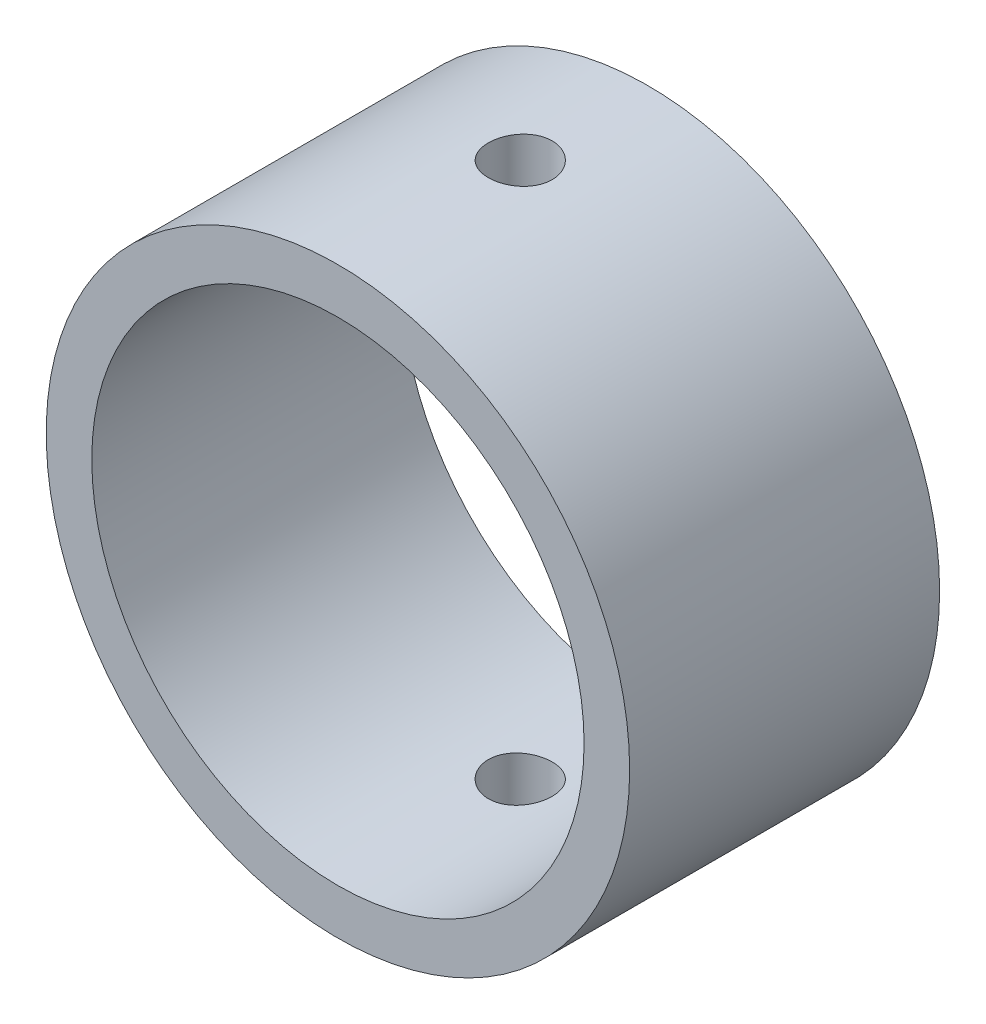
ISO-10303-21;
HEADER;
FILE_DESCRIPTION(('STEP AP214'),'2;1');
FILE_NAME('part.step','',(''),(''),'','','');
FILE_SCHEMA(('AUTOMOTIVE_DESIGN { 1 0 10303 214 1 1 1 1 }'));
ENDSEC;
DATA;
#1=APPLICATION_CONTEXT('core data for automotive mechanical design processes');
#2=APPLICATION_PROTOCOL_DEFINITION('international standard','automotive_design',2000,#1);
#3=PRODUCT_CONTEXT('',#1,'mechanical');
#4=PRODUCT('Part','Part','',(#3));
#5=PRODUCT_RELATED_PRODUCT_CATEGORY('part','',(#4));
#6=PRODUCT_DEFINITION_FORMATION('','',#4);
#7=PRODUCT_DEFINITION_CONTEXT('part definition',#1,'design');
#8=PRODUCT_DEFINITION('design','',#6,#7);
#9=PRODUCT_DEFINITION_SHAPE('','',#8);
#10=(LENGTH_UNIT() NAMED_UNIT(*) SI_UNIT(.MILLI.,.METRE.));
#11=(NAMED_UNIT(*) PLANE_ANGLE_UNIT() SI_UNIT($,.RADIAN.));
#12=(NAMED_UNIT(*) SI_UNIT($,.STERADIAN.) SOLID_ANGLE_UNIT());
#13=UNCERTAINTY_MEASURE_WITH_UNIT(LENGTH_MEASURE(1.E-05),#10,'distance_accuracy_value','');
#14=(GEOMETRIC_REPRESENTATION_CONTEXT(3) GLOBAL_UNCERTAINTY_ASSIGNED_CONTEXT((#13)) GLOBAL_UNIT_ASSIGNED_CONTEXT((#10,
#11,#12)) REPRESENTATION_CONTEXT('',''));
#15=CARTESIAN_POINT('',(0.,0.,0.));
#16=DIRECTION('',(0.,0.,1.));
#17=DIRECTION('',(1.,0.,0.));
#18=AXIS2_PLACEMENT_3D('',#15,#16,#17);
#19=CARTESIAN_POINT('',(0.,0.,17.));
#20=DIRECTION('',(0.,0.,1.));
#21=DIRECTION('',(1.,0.,0.));
#22=AXIS2_PLACEMENT_3D('',#19,#20,#21);
#23=PLANE('',#22);
#24=CARTESIAN_POINT('',(0.,0.,17.));
#25=DIRECTION('',(0.,0.,1.));
#26=DIRECTION('',(1.,0.,0.));
#27=AXIS2_PLACEMENT_3D('',#24,#25,#26);
#28=CIRCLE('',#27,16.);
#29=CARTESIAN_POINT('',(16.,0.,17.));
#30=VERTEX_POINT('',#29);
#31=EDGE_CURVE('E10',#30,#30,#28,.T.);
#32=ORIENTED_EDGE('',*,*,#31,.T.);
#33=EDGE_LOOP('',(#32));
#34=FACE_BOUND('',#33,.T.);
#35=CARTESIAN_POINT('',(0.,0.,17.));
#36=DIRECTION('',(0.,0.,1.));
#37=DIRECTION('',(1.,0.,0.));
#38=AXIS2_PLACEMENT_3D('',#35,#36,#37);
#39=CIRCLE('',#38,13.5);
#40=CARTESIAN_POINT('',(13.5,0.,17.));
#41=VERTEX_POINT('',#40);
#42=EDGE_CURVE('E62',#41,#41,#39,.T.);
#43=ORIENTED_EDGE('',*,*,#42,.F.);
#44=EDGE_LOOP('',(#43));
#45=FACE_BOUND('',#44,.T.);
#46=ADVANCED_FACE('F41',(#34,#45),#23,.T.);
#47=CARTESIAN_POINT('',(0.,0.,0.));
#48=DIRECTION('',(0.,0.,1.));
#49=DIRECTION('',(1.,0.,0.));
#50=AXIS2_PLACEMENT_3D('',#47,#48,#49);
#51=PLANE('',#50);
#52=CARTESIAN_POINT('',(0.,0.,0.));
#53=DIRECTION('',(0.,0.,1.));
#54=DIRECTION('',(1.,0.,0.));
#55=AXIS2_PLACEMENT_3D('',#52,#53,#54);
#56=CIRCLE('',#55,16.);
#57=CARTESIAN_POINT('',(16.,0.,0.));
#58=VERTEX_POINT('',#57);
#59=EDGE_CURVE('E56',#58,#58,#56,.T.);
#60=ORIENTED_EDGE('',*,*,#59,.F.);
#61=EDGE_LOOP('',(#60));
#62=FACE_BOUND('',#61,.T.);
#63=CARTESIAN_POINT('',(0.,0.,0.));
#64=DIRECTION('',(0.,0.,1.));
#65=DIRECTION('',(1.,0.,0.));
#66=AXIS2_PLACEMENT_3D('',#63,#64,#65);
#67=CIRCLE('',#66,13.5);
#68=CARTESIAN_POINT('',(13.5,0.,0.));
#69=VERTEX_POINT('',#68);
#70=EDGE_CURVE('E65',#69,#69,#67,.T.);
#71=ORIENTED_EDGE('',*,*,#70,.T.);
#72=EDGE_LOOP('',(#71));
#73=FACE_BOUND('',#72,.T.);
#74=ADVANCED_FACE('F106',(#62,#73),#51,.F.);
#75=CARTESIAN_POINT('',(0.,0.,17.));
#76=DIRECTION('',(0.,0.,-1.));
#77=DIRECTION('',(-1.,0.,0.));
#78=AXIS2_PLACEMENT_3D('',#75,#76,#77);
#79=CYLINDRICAL_SURFACE('',#78,16.);
#80=CARTESIAN_POINT('',(0.,-16.,8.75));
#81=CARTESIAN_POINT('',(0.0979843018143551,-15.9999987790546,8.74999578301326));
#82=CARTESIAN_POINT('',(0.196032147750257,-15.9990903694495,8.74174291575238));
#83=CARTESIAN_POINT('',(0.389406053914246,-15.9955539037585,8.7089471811194));
#84=CARTESIAN_POINT('',(0.48472905369742,-15.9929239876771,8.68438669382546));
#85=CARTESIAN_POINT('',(0.669825286206015,-15.9862411714912,8.61970233107951));
#86=CARTESIAN_POINT('',(0.759601964455794,-15.9821891654969,8.5795882329888));
#87=CARTESIAN_POINT('',(0.93112970242537,-15.9731144072561,8.48495519633319));
#88=CARTESIAN_POINT('',(1.01288227710051,-15.9680918387859,8.43043898409849));
#89=CARTESIAN_POINT('',(1.16640861916252,-15.9576139694109,8.3083000183278));
#90=CARTESIAN_POINT('',(1.23814328966421,-15.9521570967637,8.24062825084847));
#91=CARTESIAN_POINT('',(1.36926124274137,-15.9414385239138,8.09420399246983));
#92=CARTESIAN_POINT('',(1.42864393446778,-15.9361768330573,8.01545097180775));
#93=CARTESIAN_POINT('',(1.53351352446658,-15.9264285729729,7.84885137718232));
#94=CARTESIAN_POINT('',(1.57896456380355,-15.9219440166953,7.76098210316607));
#95=CARTESIAN_POINT('',(1.65445169087805,-15.9142777964497,7.57880120916559));
#96=CARTESIAN_POINT('',(1.68448822999473,-15.911096094331,7.48448977791718));
#97=CARTESIAN_POINT('',(1.72817669232606,-15.9064103776561,7.29250332704647));
#98=CARTESIAN_POINT('',(1.74189393457903,-15.9048996765294,7.19484333740354));
#99=CARTESIAN_POINT('',(1.75275640783932,-15.9037063759809,6.99859653508903));
#100=CARTESIAN_POINT('',(1.74990215475226,-15.9040237196482,6.9000097513659));
#101=CARTESIAN_POINT('',(1.72775641729676,-15.906444539846,6.70515986242151));
#102=CARTESIAN_POINT('',(1.70853647110364,-15.9085402426268,6.60888851629157));
#103=CARTESIAN_POINT('',(1.65431634985992,-15.9142695157677,6.42094608309255));
#104=CARTESIAN_POINT('',(1.61931592414586,-15.9179031105562,6.32927506912271));
#105=CARTESIAN_POINT('',(1.53445013907385,-15.9263076598131,6.15291082400621));
#106=CARTESIAN_POINT('',(1.48455326885256,-15.9310810209325,6.06823287511848));
#107=CARTESIAN_POINT('',(1.37133358918853,-15.9412253007222,5.90842576610933));
#108=CARTESIAN_POINT('',(1.30801030936428,-15.9465962403249,5.83329694067994));
#109=CARTESIAN_POINT('',(1.16933684669449,-15.9573651294051,5.69430516836987));
#110=CARTESIAN_POINT('',(1.09392492312116,-15.9627630717511,5.63050380407977));
#111=CARTESIAN_POINT('',(0.933428593968606,-15.9729510696445,5.51645611265039));
#112=CARTESIAN_POINT('',(0.848344174047932,-15.9777411242906,5.46620980560959));
#113=CARTESIAN_POINT('',(0.670873733844241,-15.9861756717552,5.38070013087794));
#114=CARTESIAN_POINT('',(0.578486072063111,-15.9898199061143,5.34544014297727));
#115=CARTESIAN_POINT('',(0.389052941813469,-15.9955496909124,5.29095044796761));
#116=CARTESIAN_POINT('',(0.292007640208487,-15.997635297146,5.27172016703475));
#117=CARTESIAN_POINT('',(0.0965470027036097,-16.0000056402747,5.24991447797845));
#118=CARTESIAN_POINT('',(-0.00185875179773743,-16.0002995601345,5.24725414206612));
#119=CARTESIAN_POINT('',(-0.19771469161566,-15.9990780969499,5.25844042756688));
#120=CARTESIAN_POINT('',(-0.295164892400371,-15.9975627432423,5.27228678132983));
#121=CARTESIAN_POINT('',(-0.486096435214645,-15.9928988158766,5.31602290524308));
#122=CARTESIAN_POINT('',(-0.579587052586909,-15.9897543169587,5.34587265491833));
#123=CARTESIAN_POINT('',(-0.760234536881083,-15.9821846000169,5.42072695100263));
#124=CARTESIAN_POINT('',(-0.847391235643946,-15.9777593480059,5.46573189958812));
#125=CARTESIAN_POINT('',(-1.01327917909161,-15.9680996292708,5.5698278901692));
#126=CARTESIAN_POINT('',(-1.09197541112388,-15.96286200359,5.62897443055286));
#127=CARTESIAN_POINT('',(-1.23835347755625,-15.9521746919304,5.75959544964388));
#128=CARTESIAN_POINT('',(-1.30603497987203,-15.9467249995641,5.83107029990506));
#129=CARTESIAN_POINT('',(-1.42875949939817,-15.936199887007,5.98469085519891));
#130=CARTESIAN_POINT('',(-1.48374657994462,-15.9311261877761,6.06688138168351));
#131=CARTESIAN_POINT('',(-1.57913618207849,-15.9219544983476,6.23938038998336));
#132=CARTESIAN_POINT('',(-1.61953893646867,-15.9178564925759,6.32968874218882));
#133=CARTESIAN_POINT('',(-1.684520427078,-15.9111113149953,6.51567202184659));
#134=CARTESIAN_POINT('',(-1.70913183401512,-15.9084611494493,6.61133542121312));
#135=CARTESIAN_POINT('',(-1.74193774568025,-15.9049026898973,6.80546756563143));
#136=CARTESIAN_POINT('',(-1.75013282247975,-15.9039943351932,6.90393621280547));
#137=CARTESIAN_POINT('',(-1.74986461843829,-15.9040238036485,7.10032756851717));
#138=CARTESIAN_POINT('',(-1.74148920520083,-15.9049518888033,7.19825041028481));
#139=CARTESIAN_POINT('',(-1.70850264415664,-15.9085288427142,7.39128859552244));
#140=CARTESIAN_POINT('',(-1.68389148319411,-15.9111777128646,7.48640393671746));
#141=CARTESIAN_POINT('',(-1.61915745563481,-15.9178949677973,7.67112261066374));
#142=CARTESIAN_POINT('',(-1.57903775917621,-15.9219630624559,7.76072706557284));
#143=CARTESIAN_POINT('',(-1.48443434994956,-15.931060948636,7.9319449749036));
#144=CARTESIAN_POINT('',(-1.42995062576762,-15.9360907409216,8.01355842297538));
#145=CARTESIAN_POINT('',(-1.30783689049273,-15.9465772701721,8.16692770777432));
#146=CARTESIAN_POINT('',(-1.24014134047071,-15.9520360510442,8.23863122433684));
#147=CARTESIAN_POINT('',(-1.09365872051152,-15.9627470011721,8.36969722033655));
#148=CARTESIAN_POINT('',(-1.01486901330516,-15.9679991209202,8.42905675706605));
#149=CARTESIAN_POINT('',(-0.848174506713109,-15.9777215451173,8.53389260928405));
#150=CARTESIAN_POINT('',(-0.760243456652615,-15.9821894931048,8.57932737564796));
#151=CARTESIAN_POINT('',(-0.578004813994818,-15.9898153180519,8.654724510338));
#152=CARTESIAN_POINT('',(-0.483704453373885,-15.9929746527204,8.68470410386733));
#153=CARTESIAN_POINT('',(-0.324071409938919,-15.996844625004,8.72096823435678));
#154=CARTESIAN_POINT('',(-0.259754684428682,-15.9980222874431,8.73184000541459));
#155=CARTESIAN_POINT('',(-0.130301338199593,-15.9996003789266,8.74635727179844));
#156=CARTESIAN_POINT('',(-0.0651647217252089,-16.000000811993,8.7500028045183));
#157=CARTESIAN_POINT('',(0.,-16.,8.75));
#158=B_SPLINE_CURVE_WITH_KNOTS('',3,(#80,#81,#82,#83,#84,#85,#86,#87,#88,#89,#90,#91,#92,#93,
#94,#95,#96,#97,#98,#99,#100,#101,#102,#103,#104,#105,#106,#107,#108,#109,#110,#111,#112,#113,
#114,#115,#116,#117,#118,#119,#120,#121,#122,#123,#124,#125,#126,#127,#128,#129,#130,#131,#132,
#133,#134,#135,#136,#137,#138,#139,#140,#141,#142,#143,#144,#145,#146,#147,#148,#149,#150,#151,
#152,#153,#154,#155,#156,#157),.UNSPECIFIED.,.T.,.F.,(4,2,2,2,2,2,2,2,2,2,2,2,2,2,2,2,2,2,2,2,2,
2,2,2,2,2,2,2,2,2,2,2,2,2,2,2,2,2,4),(0.,0.293714924770689,0.587747717744998,0.881595973759644,
1.1753886439055,1.47029764056423,1.76522074076505,2.06089669509721,2.35656399072616,
2.65104383415404,2.9455145098523,3.23870455634216,3.53189926014435,3.82571861506815,
4.11954826537565,4.41492944053083,4.71031105365433,5.00575924742498,5.30119686442628,
5.5951189874693,5.88903634473355,6.1822220936862,6.4754156235786,6.76977923826467,
7.06415172610911,7.35979757956081,7.65543871354794,7.95046620638349,8.24548341800815,
8.53894044747083,8.83239771472137,9.12579502733847,9.41919257309467,9.71408434883854,
10.0090463440754,10.3048800737903,10.6003833721826,10.7957202784943,10.9910561739878),.UNSPECIFIED.);
#159=CARTESIAN_POINT('',(0.,-16.,8.75));
#160=VERTEX_POINT('',#159);
#161=EDGE_CURVE('E86',#160,#160,#158,.T.);
#162=ORIENTED_EDGE('',*,*,#161,.T.);
#163=EDGE_LOOP('',(#162));
#164=FACE_BOUND('',#163,.T.);
#165=CARTESIAN_POINT('',(0.,16.,8.75));
#166=CARTESIAN_POINT('',(-0.0979843018143585,15.9999987790546,8.74999578301326));
#167=CARTESIAN_POINT('',(-0.196032147750261,15.9990903694495,8.74174291575238));
#168=CARTESIAN_POINT('',(-0.38940605391425,15.9955539037585,8.7089471811194));
#169=CARTESIAN_POINT('',(-0.484729053697424,15.9929239876771,8.68438669382546));
#170=CARTESIAN_POINT('',(-0.669825286206019,15.9862411714912,8.61970233107951));
#171=CARTESIAN_POINT('',(-0.759601964455798,15.9821891654969,8.5795882329888));
#172=CARTESIAN_POINT('',(-0.931129702425374,15.9731144072561,8.48495519633319));
#173=CARTESIAN_POINT('',(-1.01288227710051,15.9680918387859,8.43043898409849));
#174=CARTESIAN_POINT('',(-1.16640861916253,15.9576139694109,8.30830001832781));
#175=CARTESIAN_POINT('',(-1.23814328966422,15.9521570967637,8.24062825084848));
#176=CARTESIAN_POINT('',(-1.36926124274138,15.9414385239138,8.09420399246983));
#177=CARTESIAN_POINT('',(-1.42864393446779,15.9361768330573,8.01545097180775));
#178=CARTESIAN_POINT('',(-1.53351352446658,15.9264285729729,7.84885137718233));
#179=CARTESIAN_POINT('',(-1.57896456380356,15.9219440166953,7.76098210316607));
#180=CARTESIAN_POINT('',(-1.65445169087805,15.9142777964496,7.57880120916559));
#181=CARTESIAN_POINT('',(-1.68448822999474,15.911096094331,7.48448977791719));
#182=CARTESIAN_POINT('',(-1.72817669232607,15.9064103776561,7.29250332704648));
#183=CARTESIAN_POINT('',(-1.74189393457903,15.9048996765294,7.19484333740355));
#184=CARTESIAN_POINT('',(-1.75275640783933,15.9037063759809,6.99859653508903));
#185=CARTESIAN_POINT('',(-1.74990215475227,15.9040237196482,6.9000097513659));
#186=CARTESIAN_POINT('',(-1.72775641729676,15.906444539846,6.70515986242152));
#187=CARTESIAN_POINT('',(-1.70853647110364,15.9085402426268,6.60888851629157));
#188=CARTESIAN_POINT('',(-1.65431634985993,15.9142695157677,6.42094608309255));
#189=CARTESIAN_POINT('',(-1.61931592414586,15.9179031105562,6.32927506912271));
#190=CARTESIAN_POINT('',(-1.53445013907386,15.9263076598131,6.15291082400622));
#191=CARTESIAN_POINT('',(-1.48455326885257,15.9310810209325,6.06823287511848));
#192=CARTESIAN_POINT('',(-1.37133358918854,15.9412253007222,5.90842576610934));
#193=CARTESIAN_POINT('',(-1.30801030936429,15.9465962403249,5.83329694067994));
#194=CARTESIAN_POINT('',(-1.1693368466945,15.9573651294051,5.69430516836987));
#195=CARTESIAN_POINT('',(-1.09392492312117,15.9627630717511,5.63050380407978));
#196=CARTESIAN_POINT('',(-0.933428593968616,15.9729510696445,5.51645611265039));
#197=CARTESIAN_POINT('',(-0.848344174047942,15.9777411242906,5.4662098056096));
#198=CARTESIAN_POINT('',(-0.670873733844251,15.9861756717552,5.38070013087794));
#199=CARTESIAN_POINT('',(-0.578486072063121,15.9898199061143,5.34544014297727));
#200=CARTESIAN_POINT('',(-0.389052941813479,15.9955496909124,5.29095044796762));
#201=CARTESIAN_POINT('',(-0.292007640208498,15.997635297146,5.27172016703475));
#202=CARTESIAN_POINT('',(-0.0965470027036207,16.0000056402747,5.24991447797845));
#203=CARTESIAN_POINT('',(0.00185875179772642,16.0002995601345,5.24725414206612));
#204=CARTESIAN_POINT('',(0.197714691615649,15.9990780969499,5.25844042756688));
#205=CARTESIAN_POINT('',(0.29516489240036,15.9975627432423,5.27228678132983));
#206=CARTESIAN_POINT('',(0.486096435214635,15.9928988158766,5.31602290524308));
#207=CARTESIAN_POINT('',(0.579587052586898,15.9897543169587,5.34587265491832));
#208=CARTESIAN_POINT('',(0.760234536881072,15.9821846000169,5.42072695100263));
#209=CARTESIAN_POINT('',(0.847391235643936,15.9777593480059,5.46573189958811));
#210=CARTESIAN_POINT('',(1.0132791790916,15.9680996292708,5.5698278901692));
#211=CARTESIAN_POINT('',(1.09197541112387,15.96286200359,5.62897443055286));
#212=CARTESIAN_POINT('',(1.23835347755624,15.9521746919304,5.75959544964387));
#213=CARTESIAN_POINT('',(1.30603497987202,15.9467249995641,5.83107029990506));
#214=CARTESIAN_POINT('',(1.42875949939817,15.936199887007,5.9846908551989));
#215=CARTESIAN_POINT('',(1.48374657994461,15.9311261877761,6.06688138168351));
#216=CARTESIAN_POINT('',(1.57913618207848,15.9219544983476,6.23938038998336));
#217=CARTESIAN_POINT('',(1.61953893646866,15.9178564925759,6.32968874218881));
#218=CARTESIAN_POINT('',(1.68452042707799,15.9111113149953,6.51567202184658));
#219=CARTESIAN_POINT('',(1.70913183401511,15.9084611494493,6.61133542121312));
#220=CARTESIAN_POINT('',(1.74193774568024,15.9049026898973,6.80546756563143));
#221=CARTESIAN_POINT('',(1.75013282247974,15.9039943351932,6.90393621280547));
#222=CARTESIAN_POINT('',(1.74986461843828,15.9040238036485,7.10032756851717));
#223=CARTESIAN_POINT('',(1.74148920520083,15.9049518888033,7.1982504102848));
#224=CARTESIAN_POINT('',(1.70850264415663,15.9085288427142,7.39128859552244));
#225=CARTESIAN_POINT('',(1.68389148319411,15.9111777128646,7.48640393671746));
#226=CARTESIAN_POINT('',(1.61915745563481,15.9178949677973,7.67112261066373));
#227=CARTESIAN_POINT('',(1.57903775917621,15.9219630624559,7.76072706557284));
#228=CARTESIAN_POINT('',(1.48443434994956,15.931060948636,7.93194497490359));
#229=CARTESIAN_POINT('',(1.42995062576761,15.9360907409216,8.01355842297538));
#230=CARTESIAN_POINT('',(1.30783689049273,15.9465772701721,8.16692770777432));
#231=CARTESIAN_POINT('',(1.24014134047071,15.9520360510442,8.23863122433684));
#232=CARTESIAN_POINT('',(1.09365872051151,15.9627470011721,8.36969722033655));
#233=CARTESIAN_POINT('',(1.01486901330515,15.9679991209202,8.42905675706605));
#234=CARTESIAN_POINT('',(0.848174506713105,15.9777215451173,8.53389260928405));
#235=CARTESIAN_POINT('',(0.760243456652611,15.9821894931048,8.57932737564795));
#236=CARTESIAN_POINT('',(0.578004813994814,15.9898153180519,8.654724510338));
#237=CARTESIAN_POINT('',(0.483704453373881,15.9929746527204,8.68470410386733));
#238=CARTESIAN_POINT('',(0.324071409938915,15.996844625004,8.72096823435678));
#239=CARTESIAN_POINT('',(0.259754684428678,15.9980222874431,8.73184000541459));
#240=CARTESIAN_POINT('',(0.130301338199589,15.9996003789266,8.74635727179844));
#241=CARTESIAN_POINT('',(0.0651647217252053,16.000000811993,8.7500028045183));
#242=CARTESIAN_POINT('',(0.,16.,8.75));
#243=B_SPLINE_CURVE_WITH_KNOTS('',3,(#165,#166,#167,#168,#169,#170,#171,#172,#173,#174,#175,
#176,#177,#178,#179,#180,#181,#182,#183,#184,#185,#186,#187,#188,#189,#190,#191,#192,#193,#194,
#195,#196,#197,#198,#199,#200,#201,#202,#203,#204,#205,#206,#207,#208,#209,#210,#211,#212,#213,
#214,#215,#216,#217,#218,#219,#220,#221,#222,#223,#224,#225,#226,#227,#228,#229,#230,#231,#232,
#233,#234,#235,#236,#237,#238,#239,#240,#241,#242),.UNSPECIFIED.,.T.,.F.,(4,2,2,2,2,2,2,2,2,2,2,
2,2,2,2,2,2,2,2,2,2,2,2,2,2,2,2,2,2,2,2,2,2,2,2,2,2,2,4),(0.,0.293714924770689,
0.587747717744998,0.881595973759644,1.1753886439055,1.47029764056423,1.76522074076505,
2.06089669509721,2.35656399072616,2.65104383415404,2.9455145098523,3.23870455634216,
3.53189926014435,3.82571861506815,4.11954826537565,4.41492944053083,4.71031105365433,
5.00575924742498,5.30119686442628,5.5951189874693,5.88903634473355,6.1822220936862,
6.4754156235786,6.76977923826467,7.06415172610911,7.35979757956081,7.65543871354794,
7.95046620638349,8.24548341800815,8.53894044747083,8.83239771472136,9.12579502733847,
9.41919257309467,9.71408434883854,10.0090463440754,10.3048800737902,10.6003833721826,
10.7957202784943,10.9910561739878),.UNSPECIFIED.);
#244=CARTESIAN_POINT('',(0.,16.,8.75));
#245=VERTEX_POINT('',#244);
#246=EDGE_CURVE('E92',#245,#245,#243,.T.);
#247=ORIENTED_EDGE('',*,*,#246,.T.);
#248=EDGE_LOOP('',(#247));
#249=FACE_BOUND('',#248,.T.);
#250=ORIENTED_EDGE('',*,*,#31,.F.);
#251=EDGE_LOOP('',(#250));
#252=FACE_BOUND('',#251,.T.);
#253=ORIENTED_EDGE('',*,*,#59,.T.);
#254=EDGE_LOOP('',(#253));
#255=FACE_BOUND('',#254,.T.);
#256=ADVANCED_FACE('F43',(#164,#249,#252,#255),#79,.T.);
#257=CARTESIAN_POINT('',(0.,0.,17.));
#258=DIRECTION('',(0.,0.,-1.));
#259=DIRECTION('',(-1.,0.,0.));
#260=AXIS2_PLACEMENT_3D('',#257,#258,#259);
#261=CYLINDRICAL_SURFACE('',#260,13.5);
#262=CARTESIAN_POINT('',(0.,-13.5,8.75));
#263=CARTESIAN_POINT('',(0.0978580708802111,-13.4999985940015,8.74999586165585));
#264=CARTESIAN_POINT('',(0.19577654422802,-13.4989247549739,8.74176414513191));
#265=CARTESIAN_POINT('',(0.388886653671045,-13.4947442990474,8.70905734766066));
#266=CARTESIAN_POINT('',(0.484075369591695,-13.4916355842224,8.6845655023952));
#267=CARTESIAN_POINT('',(0.668902509524328,-13.4837354421693,8.62007396648202));
#268=CARTESIAN_POINT('',(0.758544699881351,-13.4789451718778,8.58008493618077));
#269=CARTESIAN_POINT('',(0.929829434227605,-13.4682140991843,8.48575797936967));
#270=CARTESIAN_POINT('',(1.01147330217313,-13.4622734876836,8.43142243314874));
#271=CARTESIAN_POINT('',(1.16494219859786,-13.4498653317351,8.3096021612308));
#272=CARTESIAN_POINT('',(1.23671320064628,-13.4433951747449,8.24204963232749));
#273=CARTESIAN_POINT('',(1.36793360665123,-13.4306781119625,8.09585862277882));
#274=CARTESIAN_POINT('',(1.42738236945295,-13.4244312178011,8.01721956563307));
#275=CARTESIAN_POINT('',(1.53247365795415,-13.4128423473424,7.85073450727883));
#276=CARTESIAN_POINT('',(1.5780652667032,-13.4075037393435,7.76285611079577));
#277=CARTESIAN_POINT('',(1.653822865718,-13.398370600278,7.58060922169231));
#278=CARTESIAN_POINT('',(1.68398948428263,-13.394576006321,7.48624099359683));
#279=CARTESIAN_POINT('',(1.72787594879827,-13.3889856355646,7.29425537087928));
#280=CARTESIAN_POINT('',(1.74168726193046,-13.3871787465848,7.19665921422417));
#281=CARTESIAN_POINT('',(1.7527541504711,-13.3857344164769,7.00051891681694));
#282=CARTESIAN_POINT('',(1.7500104402475,-13.3860968817387,6.90197481715282));
#283=CARTESIAN_POINT('',(1.7281201910014,-13.3889401371355,6.70737487051193));
#284=CARTESIAN_POINT('',(1.70907459705182,-13.3914078905253,6.61130745076853));
#285=CARTESIAN_POINT('',(1.65527880309929,-13.3981633306364,6.42374374285914));
#286=CARTESIAN_POINT('',(1.62052826301994,-13.4024510567676,6.33224755372666));
#287=CARTESIAN_POINT('',(1.53620112311587,-13.4123780410369,6.15611106399186));
#288=CARTESIAN_POINT('',(1.48658084812652,-13.4180212707139,6.07149190629098));
#289=CARTESIAN_POINT('',(1.37395399503602,-13.4300203788642,5.91174325586833));
#290=CARTESIAN_POINT('',(1.31094675873145,-13.4363762923711,5.83661423004234));
#291=CARTESIAN_POINT('',(1.17277600190541,-13.4491425113228,5.69739271070547));
#292=CARTESIAN_POINT('',(1.09752550903116,-13.4555528695591,5.63338650637385));
#293=CARTESIAN_POINT('',(0.937303257111727,-13.4676614982759,5.51890004377231));
#294=CARTESIAN_POINT('',(0.852331472672798,-13.4733597668962,5.46841982083582));
#295=CARTESIAN_POINT('',(0.675010713998888,-13.4834060969618,5.38241745779163));
#296=CARTESIAN_POINT('',(0.582658984380217,-13.4877536511139,5.34690093588185));
#297=CARTESIAN_POINT('',(0.393233542102804,-13.4946041735621,5.29190377421476));
#298=CARTESIAN_POINT('',(0.296160067557089,-13.4971072347717,5.27242232671029));
#299=CARTESIAN_POINT('',(0.10079255653404,-13.4999746284635,5.25016065622256));
#300=CARTESIAN_POINT('',(0.00251227465171369,-13.5003541771916,5.24726160700673));
#301=CARTESIAN_POINT('',(-0.193132773580357,-13.4989729223013,5.25793313012026));
#302=CARTESIAN_POINT('',(-0.290497560881871,-13.4972121677862,5.2715033246098));
#303=CARTESIAN_POINT('',(-0.481195572470777,-13.4917576120994,5.31462939282655));
#304=CARTESIAN_POINT('',(-0.57454187141307,-13.4880706894033,5.34412839621999));
#305=CARTESIAN_POINT('',(-0.754962766178178,-13.4791764341189,5.41821544249775));
#306=CARTESIAN_POINT('',(-0.842037134390586,-13.4739690463872,5.46280403265381));
#307=CARTESIAN_POINT('',(-1.00797173279364,-13.4625761572403,5.56609053635566));
#308=CARTESIAN_POINT('',(-1.08678391078615,-13.4563854095936,5.6248650592688));
#309=CARTESIAN_POINT('',(-1.23346753973809,-13.4437341665702,5.75474695296938));
#310=CARTESIAN_POINT('',(-1.30133852208649,-13.4372736596546,5.82585485172424));
#311=CARTESIAN_POINT('',(-1.42463660853873,-13.424763862934,5.97890941159834));
#312=CARTESIAN_POINT('',(-1.47998478875886,-13.418717340074,6.06091991177694));
#313=CARTESIAN_POINT('',(-1.57612032809821,-13.4077662447147,6.23314295141284));
#314=CARTESIAN_POINT('',(-1.61690799748261,-13.4028616478832,6.32335531604787));
#315=CARTESIAN_POINT('',(-1.68263785734698,-13.3947687905954,6.50916996031377));
#316=CARTESIAN_POINT('',(-1.70762403421043,-13.3915757694657,6.604756464011));
#317=CARTESIAN_POINT('',(-1.74118303320551,-13.3872541122133,6.79881264154287));
#318=CARTESIAN_POINT('',(-1.7497566813642,-13.3861253721975,6.89728217002433));
#319=CARTESIAN_POINT('',(-1.7502313187437,-13.3860632572747,7.0935237966157));
#320=CARTESIAN_POINT('',(-1.74225631312459,-13.3871135540316,7.19129561270212));
#321=CARTESIAN_POINT('',(-1.71012315838004,-13.3912560005406,7.38409641429811));
#322=CARTESIAN_POINT('',(-1.68596501169125,-13.3943481499852,7.47912540022064));
#323=CARTESIAN_POINT('',(-1.62219100594328,-13.4022207305555,7.66372356795322));
#324=CARTESIAN_POINT('',(-1.58258159001318,-13.407000457888,7.75329500756529));
#325=CARTESIAN_POINT('',(-1.48904159944588,-13.4177107427115,7.92454019948093));
#326=CARTESIAN_POINT('',(-1.43511079204587,-13.4236413189066,8.0062138233934));
#327=CARTESIAN_POINT('',(-1.31400039224604,-13.4360382722091,8.15997827081196));
#328=CARTESIAN_POINT('',(-1.24672845570673,-13.4425081905638,8.23199608095581));
#329=CARTESIAN_POINT('',(-1.10103881058087,-13.455223848739,8.36376755684687));
#330=CARTESIAN_POINT('',(-1.02261848520918,-13.4614695354948,8.42351833516667));
#331=CARTESIAN_POINT('',(-0.856488656234981,-13.4730613945474,8.52926959110052));
#332=CARTESIAN_POINT('',(-0.768742520544321,-13.4784037887186,8.57521291086009));
#333=CARTESIAN_POINT('',(-0.586758625898531,-13.4875491282039,8.65164572804684));
#334=CARTESIAN_POINT('',(-0.492527989525898,-13.4913537320141,8.68215188334583));
#335=CARTESIAN_POINT('',(-0.331517039007885,-13.4960859655287,8.71960717372482));
#336=CARTESIAN_POINT('',(-0.265748667796607,-13.4975465120262,8.73098792825847));
#337=CARTESIAN_POINT('',(-0.133329540857961,-13.4995040043458,8.74618572046526));
#338=CARTESIAN_POINT('',(-0.0666787923280279,-13.500000958023,8.75000281979593));
#339=CARTESIAN_POINT('',(0.,-13.5,8.75));
#340=B_SPLINE_CURVE_WITH_KNOTS('',3,(#262,#263,#264,#265,#266,#267,#268,#269,#270,#271,#272,
#273,#274,#275,#276,#277,#278,#279,#280,#281,#282,#283,#284,#285,#286,#287,#288,#289,#290,#291,
#292,#293,#294,#295,#296,#297,#298,#299,#300,#301,#302,#303,#304,#305,#306,#307,#308,#309,#310,
#311,#312,#313,#314,#315,#316,#317,#318,#319,#320,#321,#322,#323,#324,#325,#326,#327,#328,#329,
#330,#331,#332,#333,#334,#335,#336,#337,#338,#339),.UNSPECIFIED.,.T.,.F.,(4,2,2,2,2,2,2,2,2,2,2,
2,2,2,2,2,2,2,2,2,2,2,2,2,2,2,2,2,2,2,2,2,2,2,2,2,2,2,4),(0.,0.293330640231634,
0.586964177247355,0.880396084430899,1.17377933768977,1.46870909595199,1.76365419624685,
2.0596702985772,2.35567434246204,2.6500150436738,2.94434304384261,3.23686157321637,
3.52938643711745,3.82277906537072,4.11618612234578,4.4117765796415,4.70736780908992,
5.00306992108643,5.29875713654062,5.59232283468937,5.88588179793781,6.1783995367488,
6.47092788578083,6.76507280734543,7.05923032378183,7.35519307589709,7.65114952106175,
7.94627844762003,8.24139252022754,8.53430318209733,8.82721379986435,9.12000240519816,
9.4127957694598,9.70769134608511,10.0026562561731,10.2988259073593,10.5946752838545,
10.7945473241499,10.9944177351188),.UNSPECIFIED.);
#341=CARTESIAN_POINT('',(0.,-13.5,8.75));
#342=VERTEX_POINT('',#341);
#343=EDGE_CURVE('E46',#342,#342,#340,.T.);
#344=ORIENTED_EDGE('',*,*,#343,.F.);
#345=EDGE_LOOP('',(#344));
#346=FACE_BOUND('',#345,.T.);
#347=CARTESIAN_POINT('',(0.,13.5,8.75));
#348=CARTESIAN_POINT('',(-0.0978580708802181,13.4999985940015,8.74999586165585));
#349=CARTESIAN_POINT('',(-0.195776544228026,13.4989247549739,8.74176414513191));
#350=CARTESIAN_POINT('',(-0.388886653671052,13.4947442990474,8.70905734766066));
#351=CARTESIAN_POINT('',(-0.484075369591701,13.4916355842224,8.6845655023952));
#352=CARTESIAN_POINT('',(-0.668902509524334,13.4837354421693,8.62007396648202));
#353=CARTESIAN_POINT('',(-0.758544699881358,13.4789451718778,8.58008493618077));
#354=CARTESIAN_POINT('',(-0.929829434227612,13.4682140991843,8.48575797936967));
#355=CARTESIAN_POINT('',(-1.01147330217314,13.4622734876836,8.43142243314874));
#356=CARTESIAN_POINT('',(-1.16494219859787,13.4498653317351,8.3096021612308));
#357=CARTESIAN_POINT('',(-1.23671320064628,13.4433951747449,8.24204963232749));
#358=CARTESIAN_POINT('',(-1.36793360665124,13.4306781119625,8.09585862277882));
#359=CARTESIAN_POINT('',(-1.42738236945296,13.4244312178011,8.01721956563307));
#360=CARTESIAN_POINT('',(-1.53247365795416,13.4128423473424,7.85073450727883));
#361=CARTESIAN_POINT('',(-1.57806526670321,13.4075037393435,7.76285611079577));
#362=CARTESIAN_POINT('',(-1.653822865718,13.398370600278,7.58060922169231));
#363=CARTESIAN_POINT('',(-1.68398948428264,13.394576006321,7.48624099359683));
#364=CARTESIAN_POINT('',(-1.72787594879828,13.3889856355646,7.29425537087928));
#365=CARTESIAN_POINT('',(-1.74168726193047,13.3871787465848,7.19665921422417));
#366=CARTESIAN_POINT('',(-1.7527541504711,13.3857344164769,7.00051891681694));
#367=CARTESIAN_POINT('',(-1.75001044024751,13.3860968817387,6.90197481715282));
#368=CARTESIAN_POINT('',(-1.7281201910014,13.3889401371355,6.70737487051193));
#369=CARTESIAN_POINT('',(-1.70907459705183,13.3914078905253,6.61130745076853));
#370=CARTESIAN_POINT('',(-1.65527880309929,13.3981633306364,6.42374374285914));
#371=CARTESIAN_POINT('',(-1.62052826301995,13.4024510567676,6.33224755372666));
#372=CARTESIAN_POINT('',(-1.53620112311588,13.4123780410369,6.15611106399186));
#373=CARTESIAN_POINT('',(-1.48658084812652,13.4180212707139,6.07149190629098));
#374=CARTESIAN_POINT('',(-1.37395399503603,13.4300203788642,5.91174325586833));
#375=CARTESIAN_POINT('',(-1.31094675873146,13.4363762923711,5.83661423004234));
#376=CARTESIAN_POINT('',(-1.17277600190542,13.4491425113228,5.69739271070547));
#377=CARTESIAN_POINT('',(-1.09752550903116,13.4555528695591,5.63338650637385));
#378=CARTESIAN_POINT('',(-0.937303257111734,13.4676614982759,5.51890004377231));
#379=CARTESIAN_POINT('',(-0.852331472672805,13.4733597668962,5.46841982083582));
#380=CARTESIAN_POINT('',(-0.675010713998894,13.4834060969618,5.38241745779163));
#381=CARTESIAN_POINT('',(-0.582658984380224,13.4877536511139,5.34690093588185));
#382=CARTESIAN_POINT('',(-0.393233542102811,13.4946041735621,5.29190377421476));
#383=CARTESIAN_POINT('',(-0.296160067557095,13.4971072347717,5.27242232671029));
#384=CARTESIAN_POINT('',(-0.100792556534046,13.4999746284635,5.25016065622256));
#385=CARTESIAN_POINT('',(-0.00251227465172009,13.5003541771916,5.24726160700673));
#386=CARTESIAN_POINT('',(0.193132773580351,13.4989729223013,5.25793313012026));
#387=CARTESIAN_POINT('',(0.290497560881865,13.4972121677862,5.2715033246098));
#388=CARTESIAN_POINT('',(0.48119557247077,13.4917576120994,5.31462939282655));
#389=CARTESIAN_POINT('',(0.574541871413064,13.4880706894033,5.34412839621999));
#390=CARTESIAN_POINT('',(0.754962766178172,13.4791764341189,5.41821544249775));
#391=CARTESIAN_POINT('',(0.84203713439058,13.4739690463872,5.46280403265381));
#392=CARTESIAN_POINT('',(1.00797173279363,13.4625761572403,5.56609053635566));
#393=CARTESIAN_POINT('',(1.08678391078614,13.4563854095936,5.6248650592688));
#394=CARTESIAN_POINT('',(1.23346753973809,13.4437341665702,5.75474695296938));
#395=CARTESIAN_POINT('',(1.30133852208648,13.4372736596546,5.82585485172424));
#396=CARTESIAN_POINT('',(1.42463660853873,13.424763862934,5.97890941159834));
#397=CARTESIAN_POINT('',(1.47998478875886,13.418717340074,6.06091991177694));
#398=CARTESIAN_POINT('',(1.5761203280982,13.4077662447147,6.23314295141284));
#399=CARTESIAN_POINT('',(1.61690799748261,13.4028616478832,6.32335531604787));
#400=CARTESIAN_POINT('',(1.68263785734697,13.3947687905954,6.50916996031377));
#401=CARTESIAN_POINT('',(1.70762403421043,13.3915757694657,6.604756464011));
#402=CARTESIAN_POINT('',(1.7411830332055,13.3872541122133,6.79881264154287));
#403=CARTESIAN_POINT('',(1.74975668136419,13.3861253721975,6.89728217002433));
#404=CARTESIAN_POINT('',(1.75023131874369,13.3860632572747,7.0935237966157));
#405=CARTESIAN_POINT('',(1.74225631312458,13.3871135540316,7.19129561270212));
#406=CARTESIAN_POINT('',(1.71012315838003,13.3912560005406,7.38409641429811));
#407=CARTESIAN_POINT('',(1.68596501169124,13.3943481499852,7.47912540022064));
#408=CARTESIAN_POINT('',(1.62219100594327,13.4022207305555,7.66372356795322));
#409=CARTESIAN_POINT('',(1.58258159001318,13.407000457888,7.75329500756529));
#410=CARTESIAN_POINT('',(1.48904159944588,13.4177107427115,7.92454019948093));
#411=CARTESIAN_POINT('',(1.43511079204586,13.4236413189066,8.0062138233934));
#412=CARTESIAN_POINT('',(1.31400039224603,13.4360382722091,8.15997827081196));
#413=CARTESIAN_POINT('',(1.24672845570673,13.4425081905638,8.23199608095581));
#414=CARTESIAN_POINT('',(1.10103881058087,13.455223848739,8.36376755684687));
#415=CARTESIAN_POINT('',(1.02261848520918,13.4614695354948,8.42351833516667));
#416=CARTESIAN_POINT('',(0.856488656234974,13.4730613945474,8.52926959110052));
#417=CARTESIAN_POINT('',(0.768742520544314,13.4784037887186,8.57521291086009));
#418=CARTESIAN_POINT('',(0.586758625898524,13.4875491282039,8.65164572804684));
#419=CARTESIAN_POINT('',(0.49252798952589,13.4913537320141,8.68215188334583));
#420=CARTESIAN_POINT('',(0.331517039007879,13.4960859655287,8.71960717372482));
#421=CARTESIAN_POINT('',(0.265748667796601,13.4975465120262,8.73098792825847));
#422=CARTESIAN_POINT('',(0.133329540857955,13.4995040043458,8.74618572046526));
#423=CARTESIAN_POINT('',(0.0666787923280215,13.500000958023,8.75000281979593));
#424=CARTESIAN_POINT('',(0.,13.5,8.75));
#425=B_SPLINE_CURVE_WITH_KNOTS('',3,(#347,#348,#349,#350,#351,#352,#353,#354,#355,#356,#357,
#358,#359,#360,#361,#362,#363,#364,#365,#366,#367,#368,#369,#370,#371,#372,#373,#374,#375,#376,
#377,#378,#379,#380,#381,#382,#383,#384,#385,#386,#387,#388,#389,#390,#391,#392,#393,#394,#395,
#396,#397,#398,#399,#400,#401,#402,#403,#404,#405,#406,#407,#408,#409,#410,#411,#412,#413,#414,
#415,#416,#417,#418,#419,#420,#421,#422,#423,#424),.UNSPECIFIED.,.T.,.F.,(4,2,2,2,2,2,2,2,2,2,2,
2,2,2,2,2,2,2,2,2,2,2,2,2,2,2,2,2,2,2,2,2,2,2,2,2,2,2,4),(0.,0.293330640231634,
0.586964177247355,0.880396084430899,1.17377933768977,1.46870909595199,1.76365419624685,
2.0596702985772,2.35567434246204,2.65001504367381,2.94434304384261,3.23686157321637,
3.52938643711745,3.82277906537072,4.11618612234578,4.4117765796415,4.70736780908992,
5.00306992108643,5.29875713654062,5.59232283468937,5.88588179793781,6.1783995367488,
6.47092788578083,6.76507280734543,7.05923032378183,7.35519307589709,7.65114952106174,
7.94627844762003,8.24139252022754,8.53430318209733,8.82721379986435,9.12000240519816,
9.4127957694598,9.70769134608511,10.0026562561731,10.2988259073593,10.5946752838545,
10.7945473241499,10.9944177351188),.UNSPECIFIED.);
#426=CARTESIAN_POINT('',(0.,13.5,8.75));
#427=VERTEX_POINT('',#426);
#428=EDGE_CURVE('E67',#427,#427,#425,.T.);
#429=ORIENTED_EDGE('',*,*,#428,.F.);
#430=EDGE_LOOP('',(#429));
#431=FACE_BOUND('',#430,.T.);
#432=ORIENTED_EDGE('',*,*,#42,.T.);
#433=EDGE_LOOP('',(#432));
#434=FACE_BOUND('',#433,.T.);
#435=ORIENTED_EDGE('',*,*,#70,.F.);
#436=EDGE_LOOP('',(#435));
#437=FACE_BOUND('',#436,.T.);
#438=ADVANCED_FACE('F73',(#346,#431,#434,#437),#261,.F.);
#439=CARTESIAN_POINT('',(0.,-19.,7.));
#440=DIRECTION('',(0.,1.,0.));
#441=DIRECTION('',(0.,0.,1.));
#442=AXIS2_PLACEMENT_3D('',#439,#440,#441);
#443=CYLINDRICAL_SURFACE('',#442,1.75);
#444=ORIENTED_EDGE('',*,*,#428,.T.);
#445=EDGE_LOOP('',(#444));
#446=FACE_BOUND('',#445,.T.);
#447=ORIENTED_EDGE('',*,*,#246,.F.);
#448=EDGE_LOOP('',(#447));
#449=FACE_BOUND('',#448,.T.);
#450=ADVANCED_FACE('F76',(#446,#449),#443,.F.);
#451=ORIENTED_EDGE('',*,*,#343,.T.);
#452=EDGE_LOOP('',(#451));
#453=FACE_BOUND('',#452,.T.);
#454=ORIENTED_EDGE('',*,*,#161,.F.);
#455=EDGE_LOOP('',(#454));
#456=FACE_BOUND('',#455,.T.);
#457=ADVANCED_FACE('F79',(#453,#456),#443,.F.);
#458=CLOSED_SHELL('',(#46,#74,#256,#438,#450,#457));
#459=MANIFOLD_SOLID_BREP('B2',#458);
#460=ADVANCED_BREP_SHAPE_REPRESENTATION('',(#18,#459),#14);
#461=SHAPE_DEFINITION_REPRESENTATION(#9,#460);
ENDSEC;
END-ISO-10303-21;
